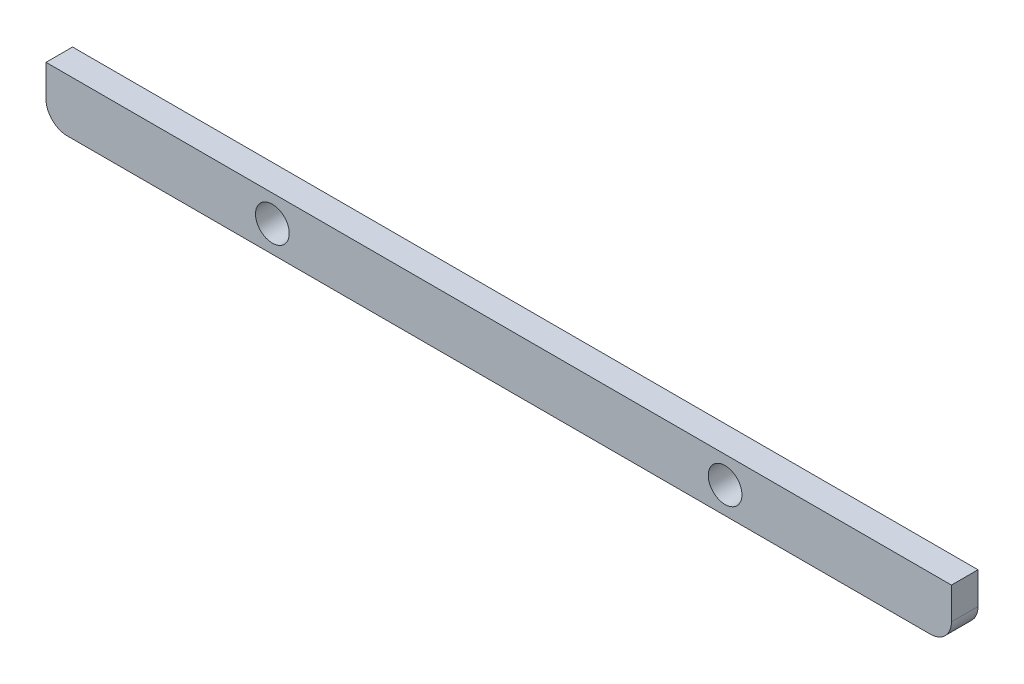
ISO-10303-21;
HEADER;
FILE_DESCRIPTION(('STEP AP214'),'2;1');
FILE_NAME('part.step','',(''),(''),'','','');
FILE_SCHEMA(('AUTOMOTIVE_DESIGN { 1 0 10303 214 1 1 1 1 }'));
ENDSEC;
DATA;
#1=APPLICATION_CONTEXT('core data for automotive mechanical design processes');
#2=APPLICATION_PROTOCOL_DEFINITION('international standard','automotive_design',2000,#1);
#3=PRODUCT_CONTEXT('',#1,'mechanical');
#4=PRODUCT('Part','Part','',(#3));
#5=PRODUCT_RELATED_PRODUCT_CATEGORY('part','',(#4));
#6=PRODUCT_DEFINITION_FORMATION('','',#4);
#7=PRODUCT_DEFINITION_CONTEXT('part definition',#1,'design');
#8=PRODUCT_DEFINITION('design','',#6,#7);
#9=PRODUCT_DEFINITION_SHAPE('','',#8);
#10=(LENGTH_UNIT() NAMED_UNIT(*) SI_UNIT(.MILLI.,.METRE.));
#11=(NAMED_UNIT(*) PLANE_ANGLE_UNIT() SI_UNIT($,.RADIAN.));
#12=(NAMED_UNIT(*) SI_UNIT($,.STERADIAN.) SOLID_ANGLE_UNIT());
#13=UNCERTAINTY_MEASURE_WITH_UNIT(LENGTH_MEASURE(1.E-05),#10,'distance_accuracy_value','');
#14=(GEOMETRIC_REPRESENTATION_CONTEXT(3) GLOBAL_UNCERTAINTY_ASSIGNED_CONTEXT((#13)) GLOBAL_UNIT_ASSIGNED_CONTEXT((#10,
#11,#12)) REPRESENTATION_CONTEXT('',''));
#15=CARTESIAN_POINT('',(0.,0.,0.));
#16=DIRECTION('',(0.,0.,1.));
#17=DIRECTION('',(1.,0.,0.));
#18=AXIS2_PLACEMENT_3D('',#15,#16,#17);
#19=CARTESIAN_POINT('',(-85.24,5.,2.5));
#20=DIRECTION('',(1.,0.,0.));
#21=DIRECTION('',(0.,0.,-1.));
#22=AXIS2_PLACEMENT_3D('',#19,#20,#21);
#23=PLANE('',#22);
#24=DIRECTION('',(0.,-1.,0.));
#25=VECTOR('',#24,1.);
#26=CARTESIAN_POINT('',(-85.24,5.,-2.5));
#27=LINE('',#26,#25);
#28=CARTESIAN_POINT('',(-85.24,5.,-2.5));
#29=VERTEX_POINT('',#28);
#30=CARTESIAN_POINT('',(-85.24,-1.,-2.5));
#31=VERTEX_POINT('',#30);
#32=EDGE_CURVE('E121',#29,#31,#27,.T.);
#33=ORIENTED_EDGE('',*,*,#32,.T.);
#34=DIRECTION('',(0.,0.,-1.));
#35=VECTOR('',#34,1.);
#36=CARTESIAN_POINT('',(-85.24,-1.,2.5));
#37=LINE('',#36,#35);
#38=CARTESIAN_POINT('',(-85.24,-1.,2.5));
#39=VERTEX_POINT('',#38);
#40=EDGE_CURVE('E11',#39,#31,#37,.T.);
#41=ORIENTED_EDGE('',*,*,#40,.F.);
#42=DIRECTION('',(0.,-1.,0.));
#43=VECTOR('',#42,1.);
#44=CARTESIAN_POINT('',(-85.24,5.,2.5));
#45=LINE('',#44,#43);
#46=CARTESIAN_POINT('',(-85.24,5.,2.5));
#47=VERTEX_POINT('',#46);
#48=EDGE_CURVE('E132',#47,#39,#45,.T.);
#49=ORIENTED_EDGE('',*,*,#48,.F.);
#50=DIRECTION('',(0.,0.,-1.));
#51=VECTOR('',#50,1.);
#52=CARTESIAN_POINT('',(-85.24,5.,2.5));
#53=LINE('',#52,#51);
#54=EDGE_CURVE('E117',#47,#29,#53,.T.);
#55=ORIENTED_EDGE('',*,*,#54,.T.);
#56=EDGE_LOOP('',(#33,#41,#49,#55));
#57=FACE_BOUND('',#56,.T.);
#58=ADVANCED_FACE('F37',(#57),#23,.F.);
#59=CARTESIAN_POINT('',(-81.24,-1.,2.5));
#60=DIRECTION('',(0.,0.,-1.));
#61=DIRECTION('',(-1.,0.,0.));
#62=AXIS2_PLACEMENT_3D('',#59,#60,#61);
#63=CYLINDRICAL_SURFACE('',#62,4.);
#64=CARTESIAN_POINT('',(-81.24,-1.,-2.5));
#65=DIRECTION('',(0.,0.,1.));
#66=DIRECTION('',(1.,0.,0.));
#67=AXIS2_PLACEMENT_3D('',#64,#65,#66);
#68=CIRCLE('',#67,4.);
#69=CARTESIAN_POINT('',(-81.24,-5.,-2.5));
#70=VERTEX_POINT('',#69);
#71=EDGE_CURVE('E124',#31,#70,#68,.T.);
#72=ORIENTED_EDGE('',*,*,#71,.T.);
#73=DIRECTION('',(0.,0.,-1.));
#74=VECTOR('',#73,1.);
#75=CARTESIAN_POINT('',(-81.24,-5.,2.5));
#76=LINE('',#75,#74);
#77=CARTESIAN_POINT('',(-81.24,-5.,2.5));
#78=VERTEX_POINT('',#77);
#79=EDGE_CURVE('E45',#78,#70,#76,.T.);
#80=ORIENTED_EDGE('',*,*,#79,.F.);
#81=CARTESIAN_POINT('',(-81.24,-1.,2.5));
#82=DIRECTION('',(0.,0.,1.));
#83=DIRECTION('',(1.,0.,0.));
#84=AXIS2_PLACEMENT_3D('',#81,#82,#83);
#85=CIRCLE('',#84,4.);
#86=EDGE_CURVE('E90',#39,#78,#85,.T.);
#87=ORIENTED_EDGE('',*,*,#86,.F.);
#88=ORIENTED_EDGE('',*,*,#40,.T.);
#89=EDGE_LOOP('',(#72,#80,#87,#88));
#90=FACE_BOUND('',#89,.T.);
#91=ADVANCED_FACE('F157',(#90),#63,.T.);
#92=CARTESIAN_POINT('',(-81.24,-5.,2.5));
#93=DIRECTION('',(0.,1.,0.));
#94=DIRECTION('',(0.,0.,1.));
#95=AXIS2_PLACEMENT_3D('',#92,#93,#94);
#96=PLANE('',#95);
#97=DIRECTION('',(1.,0.,0.));
#98=VECTOR('',#97,1.);
#99=CARTESIAN_POINT('',(-81.24,-5.,-2.5));
#100=LINE('',#99,#98);
#101=CARTESIAN_POINT('',(81.24,-5.,-2.5));
#102=VERTEX_POINT('',#101);
#103=EDGE_CURVE('E127',#70,#102,#100,.T.);
#104=ORIENTED_EDGE('',*,*,#103,.T.);
#105=DIRECTION('',(0.,0.,-1.));
#106=VECTOR('',#105,1.);
#107=CARTESIAN_POINT('',(81.24,-5.,2.5));
#108=LINE('',#107,#106);
#109=CARTESIAN_POINT('',(81.24,-5.,2.5));
#110=VERTEX_POINT('',#109);
#111=EDGE_CURVE('E112',#110,#102,#108,.T.);
#112=ORIENTED_EDGE('',*,*,#111,.F.);
#113=DIRECTION('',(1.,0.,0.));
#114=VECTOR('',#113,1.);
#115=CARTESIAN_POINT('',(-81.24,-5.,2.5));
#116=LINE('',#115,#114);
#117=EDGE_CURVE('E103',#78,#110,#116,.T.);
#118=ORIENTED_EDGE('',*,*,#117,.F.);
#119=ORIENTED_EDGE('',*,*,#79,.T.);
#120=EDGE_LOOP('',(#104,#112,#118,#119));
#121=FACE_BOUND('',#120,.T.);
#122=ADVANCED_FACE('F138',(#121),#96,.F.);
#123=CARTESIAN_POINT('',(81.24,-1.,2.5));
#124=DIRECTION('',(0.,0.,-1.));
#125=DIRECTION('',(-1.,0.,0.));
#126=AXIS2_PLACEMENT_3D('',#123,#124,#125);
#127=CYLINDRICAL_SURFACE('',#126,4.);
#128=CARTESIAN_POINT('',(81.24,-1.,-2.5));
#129=DIRECTION('',(0.,0.,1.));
#130=DIRECTION('',(1.,0.,0.));
#131=AXIS2_PLACEMENT_3D('',#128,#129,#130);
#132=CIRCLE('',#131,4.);
#133=CARTESIAN_POINT('',(85.24,-1.,-2.5));
#134=VERTEX_POINT('',#133);
#135=EDGE_CURVE('E111',#102,#134,#132,.T.);
#136=ORIENTED_EDGE('',*,*,#135,.T.);
#137=DIRECTION('',(0.,0.,-1.));
#138=VECTOR('',#137,1.);
#139=CARTESIAN_POINT('',(85.24,-1.,2.5));
#140=LINE('',#139,#138);
#141=CARTESIAN_POINT('',(85.24,-1.,2.5));
#142=VERTEX_POINT('',#141);
#143=EDGE_CURVE('E108',#142,#134,#140,.T.);
#144=ORIENTED_EDGE('',*,*,#143,.F.);
#145=CARTESIAN_POINT('',(81.24,-1.,2.5));
#146=DIRECTION('',(0.,0.,1.));
#147=DIRECTION('',(1.,0.,0.));
#148=AXIS2_PLACEMENT_3D('',#145,#146,#147);
#149=CIRCLE('',#148,4.);
#150=EDGE_CURVE('E97',#110,#142,#149,.T.);
#151=ORIENTED_EDGE('',*,*,#150,.F.);
#152=ORIENTED_EDGE('',*,*,#111,.T.);
#153=EDGE_LOOP('',(#136,#144,#151,#152));
#154=FACE_BOUND('',#153,.T.);
#155=ADVANCED_FACE('F109',(#154),#127,.T.);
#156=CARTESIAN_POINT('',(85.24,5.,2.5));
#157=DIRECTION('',(-1.,0.,0.));
#158=DIRECTION('',(0.,0.,1.));
#159=AXIS2_PLACEMENT_3D('',#156,#157,#158);
#160=PLANE('',#159);
#161=DIRECTION('',(0.,1.,0.));
#162=VECTOR('',#161,1.);
#163=CARTESIAN_POINT('',(85.24,5.,-2.5));
#164=LINE('',#163,#162);
#165=CARTESIAN_POINT('',(85.24,5.,-2.5));
#166=VERTEX_POINT('',#165);
#167=EDGE_CURVE('E76',#134,#166,#164,.T.);
#168=ORIENTED_EDGE('',*,*,#167,.T.);
#169=DIRECTION('',(0.,0.,-1.));
#170=VECTOR('',#169,1.);
#171=CARTESIAN_POINT('',(85.24,5.,2.5));
#172=LINE('',#171,#170);
#173=CARTESIAN_POINT('',(85.24,5.,2.5));
#174=VERTEX_POINT('',#173);
#175=EDGE_CURVE('E113',#174,#166,#172,.T.);
#176=ORIENTED_EDGE('',*,*,#175,.F.);
#177=DIRECTION('',(0.,1.,0.));
#178=VECTOR('',#177,1.);
#179=CARTESIAN_POINT('',(85.24,5.,2.5));
#180=LINE('',#179,#178);
#181=EDGE_CURVE('E101',#142,#174,#180,.T.);
#182=ORIENTED_EDGE('',*,*,#181,.F.);
#183=ORIENTED_EDGE('',*,*,#143,.T.);
#184=EDGE_LOOP('',(#168,#176,#182,#183));
#185=FACE_BOUND('',#184,.T.);
#186=ADVANCED_FACE('F115',(#185),#160,.F.);
#187=CARTESIAN_POINT('',(-85.24,5.,2.5));
#188=DIRECTION('',(0.,-1.,0.));
#189=DIRECTION('',(0.,0.,-1.));
#190=AXIS2_PLACEMENT_3D('',#187,#188,#189);
#191=PLANE('',#190);
#192=DIRECTION('',(-1.,0.,0.));
#193=VECTOR('',#192,1.);
#194=CARTESIAN_POINT('',(-85.24,5.,-2.5));
#195=LINE('',#194,#193);
#196=EDGE_CURVE('E82',#166,#29,#195,.T.);
#197=ORIENTED_EDGE('',*,*,#196,.T.);
#198=ORIENTED_EDGE('',*,*,#54,.F.);
#199=DIRECTION('',(-1.,0.,0.));
#200=VECTOR('',#199,1.);
#201=CARTESIAN_POINT('',(-85.24,5.,2.5));
#202=LINE('',#201,#200);
#203=EDGE_CURVE('E53',#174,#47,#202,.T.);
#204=ORIENTED_EDGE('',*,*,#203,.F.);
#205=ORIENTED_EDGE('',*,*,#175,.T.);
#206=EDGE_LOOP('',(#197,#198,#204,#205));
#207=FACE_BOUND('',#206,.T.);
#208=ADVANCED_FACE('F145',(#207),#191,.F.);
#209=CARTESIAN_POINT('',(-81.24,-1.,2.5));
#210=DIRECTION('',(0.,0.,1.));
#211=DIRECTION('',(1.,0.,0.));
#212=AXIS2_PLACEMENT_3D('',#209,#210,#211);
#213=PLANE('',#212);
#214=CARTESIAN_POINT('',(42.62,0.,2.5));
#215=DIRECTION('',(0.,0.,1.));
#216=DIRECTION('',(1.,0.,0.));
#217=AXIS2_PLACEMENT_3D('',#214,#215,#216);
#218=CIRCLE('',#217,3.175);
#219=CARTESIAN_POINT('',(45.795,0.,2.5));
#220=VERTEX_POINT('',#219);
#221=EDGE_CURVE('E256',#220,#220,#218,.T.);
#222=ORIENTED_EDGE('',*,*,#221,.F.);
#223=EDGE_LOOP('',(#222));
#224=FACE_BOUND('',#223,.T.);
#225=CARTESIAN_POINT('',(-42.62,0.,2.5));
#226=DIRECTION('',(0.,0.,1.));
#227=DIRECTION('',(1.,0.,0.));
#228=AXIS2_PLACEMENT_3D('',#225,#226,#227);
#229=CIRCLE('',#228,3.175);
#230=CARTESIAN_POINT('',(-39.445,0.,2.5));
#231=VERTEX_POINT('',#230);
#232=EDGE_CURVE('E257',#231,#231,#229,.T.);
#233=ORIENTED_EDGE('',*,*,#232,.F.);
#234=EDGE_LOOP('',(#233));
#235=FACE_BOUND('',#234,.T.);
#236=ORIENTED_EDGE('',*,*,#48,.T.);
#237=ORIENTED_EDGE('',*,*,#86,.T.);
#238=ORIENTED_EDGE('',*,*,#117,.T.);
#239=ORIENTED_EDGE('',*,*,#150,.T.);
#240=ORIENTED_EDGE('',*,*,#181,.T.);
#241=ORIENTED_EDGE('',*,*,#203,.T.);
#242=EDGE_LOOP('',(#236,#237,#238,#239,#240,#241));
#243=FACE_BOUND('',#242,.T.);
#244=ADVANCED_FACE('F99',(#224,#235,#243),#213,.T.);
#245=CARTESIAN_POINT('',(-81.24,-1.,-2.5));
#246=DIRECTION('',(0.,0.,1.));
#247=DIRECTION('',(1.,0.,0.));
#248=AXIS2_PLACEMENT_3D('',#245,#246,#247);
#249=PLANE('',#248);
#250=CARTESIAN_POINT('',(42.62,0.,-2.5));
#251=DIRECTION('',(0.,0.,1.));
#252=DIRECTION('',(1.,0.,0.));
#253=AXIS2_PLACEMENT_3D('',#250,#251,#252);
#254=CIRCLE('',#253,3.175);
#255=CARTESIAN_POINT('',(45.795,0.,-2.5));
#256=VERTEX_POINT('',#255);
#257=EDGE_CURVE('E125',#256,#256,#254,.T.);
#258=ORIENTED_EDGE('',*,*,#257,.T.);
#259=EDGE_LOOP('',(#258));
#260=FACE_BOUND('',#259,.T.);
#261=CARTESIAN_POINT('',(-42.62,0.,-2.5));
#262=DIRECTION('',(0.,0.,1.));
#263=DIRECTION('',(1.,0.,0.));
#264=AXIS2_PLACEMENT_3D('',#261,#262,#263);
#265=CIRCLE('',#264,3.175);
#266=CARTESIAN_POINT('',(-39.445,0.,-2.5));
#267=VERTEX_POINT('',#266);
#268=EDGE_CURVE('E261',#267,#267,#265,.T.);
#269=ORIENTED_EDGE('',*,*,#268,.T.);
#270=EDGE_LOOP('',(#269));
#271=FACE_BOUND('',#270,.T.);
#272=ORIENTED_EDGE('',*,*,#32,.F.);
#273=ORIENTED_EDGE('',*,*,#196,.F.);
#274=ORIENTED_EDGE('',*,*,#167,.F.);
#275=ORIENTED_EDGE('',*,*,#135,.F.);
#276=ORIENTED_EDGE('',*,*,#103,.F.);
#277=ORIENTED_EDGE('',*,*,#71,.F.);
#278=EDGE_LOOP('',(#272,#273,#274,#275,#276,#277));
#279=FACE_BOUND('',#278,.T.);
#280=ADVANCED_FACE('F141',(#260,#271,#279),#249,.F.);
#281=CARTESIAN_POINT('',(-42.62,0.,-2.5));
#282=DIRECTION('',(0.,0.,1.));
#283=DIRECTION('',(1.,0.,0.));
#284=AXIS2_PLACEMENT_3D('',#281,#282,#283);
#285=CYLINDRICAL_SURFACE('',#284,3.175);
#286=ORIENTED_EDGE('',*,*,#268,.F.);
#287=EDGE_LOOP('',(#286));
#288=FACE_BOUND('',#287,.T.);
#289=ORIENTED_EDGE('',*,*,#232,.T.);
#290=EDGE_LOOP('',(#289));
#291=FACE_BOUND('',#290,.T.);
#292=ADVANCED_FACE('F197',(#288,#291),#285,.F.);
#293=CARTESIAN_POINT('',(42.62,0.,-2.5));
#294=DIRECTION('',(0.,0.,1.));
#295=DIRECTION('',(1.,0.,0.));
#296=AXIS2_PLACEMENT_3D('',#293,#294,#295);
#297=CYLINDRICAL_SURFACE('',#296,3.175);
#298=ORIENTED_EDGE('',*,*,#257,.F.);
#299=EDGE_LOOP('',(#298));
#300=FACE_BOUND('',#299,.T.);
#301=ORIENTED_EDGE('',*,*,#221,.T.);
#302=EDGE_LOOP('',(#301));
#303=FACE_BOUND('',#302,.T.);
#304=ADVANCED_FACE('F207',(#300,#303),#297,.F.);
#305=CLOSED_SHELL('',(#58,#91,#122,#155,#186,#208,#244,#280,#292,#304));
#306=MANIFOLD_SOLID_BREP('B2',#305);
#307=ADVANCED_BREP_SHAPE_REPRESENTATION('',(#18,#306),#14);
#308=SHAPE_DEFINITION_REPRESENTATION(#9,#307);
ENDSEC;
END-ISO-10303-21;
